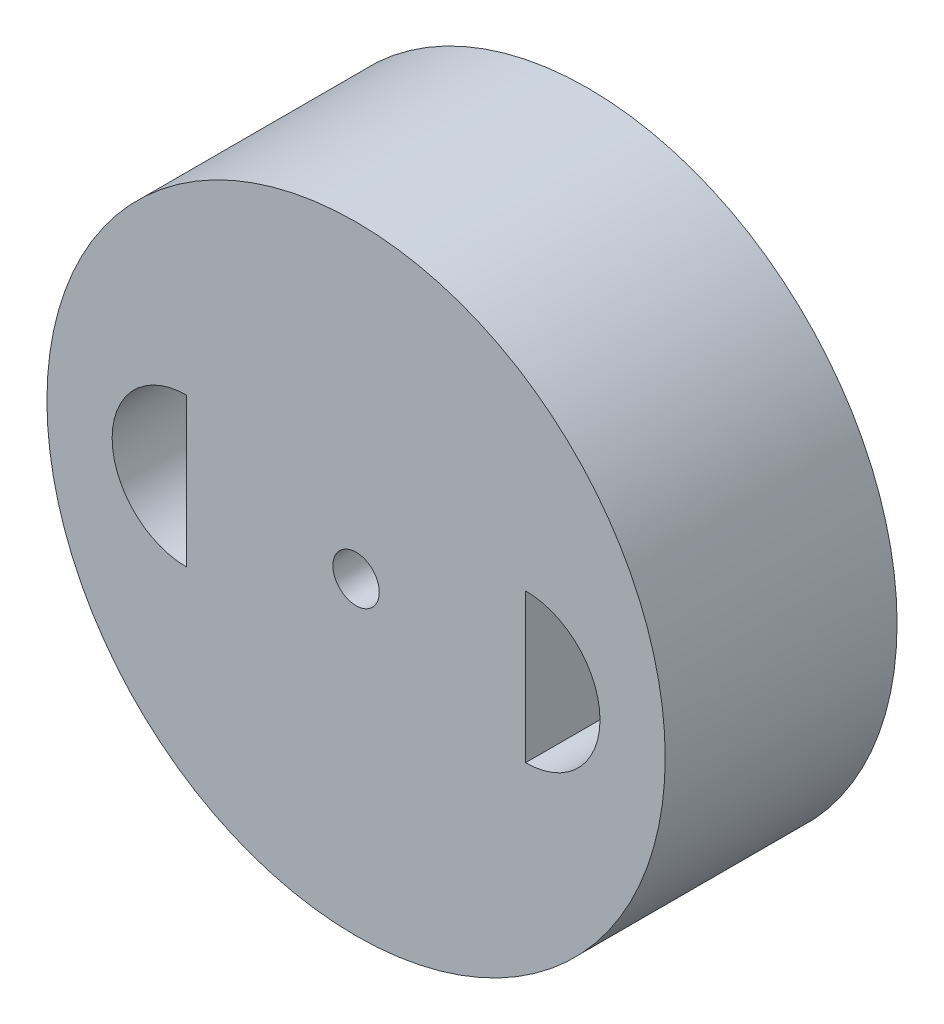
ISO-10303-21;
HEADER;
FILE_DESCRIPTION(('STEP AP214'),'2;1');
FILE_NAME('part.step','',(''),(''),'','','');
FILE_SCHEMA(('AUTOMOTIVE_DESIGN { 1 0 10303 214 1 1 1 1 }'));
ENDSEC;
DATA;
#1=APPLICATION_CONTEXT('core data for automotive mechanical design processes');
#2=APPLICATION_PROTOCOL_DEFINITION('international standard','automotive_design',2000,#1);
#3=PRODUCT_CONTEXT('',#1,'mechanical');
#4=PRODUCT('Part','Part','',(#3));
#5=PRODUCT_RELATED_PRODUCT_CATEGORY('part','',(#4));
#6=PRODUCT_DEFINITION_FORMATION('','',#4);
#7=PRODUCT_DEFINITION_CONTEXT('part definition',#1,'design');
#8=PRODUCT_DEFINITION('design','',#6,#7);
#9=PRODUCT_DEFINITION_SHAPE('','',#8);
#10=(LENGTH_UNIT() NAMED_UNIT(*) SI_UNIT(.MILLI.,.METRE.));
#11=(NAMED_UNIT(*) PLANE_ANGLE_UNIT() SI_UNIT($,.RADIAN.));
#12=(NAMED_UNIT(*) SI_UNIT($,.STERADIAN.) SOLID_ANGLE_UNIT());
#13=UNCERTAINTY_MEASURE_WITH_UNIT(LENGTH_MEASURE(1.E-05),#10,'distance_accuracy_value','');
#14=(GEOMETRIC_REPRESENTATION_CONTEXT(3) GLOBAL_UNCERTAINTY_ASSIGNED_CONTEXT((#13)) GLOBAL_UNIT_ASSIGNED_CONTEXT((#10,
#11,#12)) REPRESENTATION_CONTEXT('',''));
#15=CARTESIAN_POINT('',(0.,0.,0.));
#16=DIRECTION('',(0.,0.,1.));
#17=DIRECTION('',(1.,0.,0.));
#18=AXIS2_PLACEMENT_3D('',#15,#16,#17);
#19=CARTESIAN_POINT('',(0.,0.,76.2));
#20=DIRECTION('',(0.,0.,1.));
#21=DIRECTION('',(1.,0.,0.));
#22=AXIS2_PLACEMENT_3D('',#19,#20,#21);
#23=PLANE('',#22);
#24=CARTESIAN_POINT('',(0.,0.,76.2));
#25=DIRECTION('',(0.,0.,1.));
#26=DIRECTION('',(1.,0.,0.));
#27=AXIS2_PLACEMENT_3D('',#24,#25,#26);
#28=CIRCLE('',#27,7.62);
#29=CARTESIAN_POINT('',(7.62,0.,76.2));
#30=VERTEX_POINT('',#29);
#31=EDGE_CURVE('E96',#30,#30,#28,.T.);
#32=ORIENTED_EDGE('',*,*,#31,.F.);
#33=EDGE_LOOP('',(#32));
#34=FACE_BOUND('',#33,.T.);
#35=DIRECTION('',(0.,1.,0.));
#36=VECTOR('',#35,1.);
#37=CARTESIAN_POINT('',(55.7030268418047,0.,76.2));
#38=LINE('',#37,#36);
#39=CARTESIAN_POINT('',(55.7030268418047,24.4621758088346,76.2));
#40=VERTEX_POINT('',#39);
#41=CARTESIAN_POINT('',(55.7030268418047,-24.4621758088346,76.2));
#42=VERTEX_POINT('',#41);
#43=EDGE_CURVE('E112',#40,#42,#38,.F.);
#44=ORIENTED_EDGE('',*,*,#43,.F.);
#45=CARTESIAN_POINT('',(55.7030268418047,0.,76.2));
#46=DIRECTION('',(0.,0.,1.));
#47=DIRECTION('',(1.,0.,0.));
#48=AXIS2_PLACEMENT_3D('',#45,#46,#47);
#49=CIRCLE('',#48,24.4621758088346);
#50=EDGE_CURVE('E99',#42,#40,#49,.T.);
#51=ORIENTED_EDGE('',*,*,#50,.F.);
#52=EDGE_LOOP('',(#44,#51));
#53=FACE_BOUND('',#52,.T.);
#54=CARTESIAN_POINT('',(0.,0.,76.2));
#55=DIRECTION('',(0.,0.,1.));
#56=DIRECTION('',(1.,0.,0.));
#57=AXIS2_PLACEMENT_3D('',#54,#55,#56);
#58=CIRCLE('',#57,101.6);
#59=CARTESIAN_POINT('',(-101.6,0.,76.2));
#60=VERTEX_POINT('',#59);
#61=EDGE_CURVE('E11',#60,#60,#58,.T.);
#62=ORIENTED_EDGE('',*,*,#61,.T.);
#63=EDGE_LOOP('',(#62));
#64=FACE_BOUND('',#63,.T.);
#65=DIRECTION('',(0.,1.,0.));
#66=VECTOR('',#65,1.);
#67=CARTESIAN_POINT('',(-55.7030268418047,0.,76.2));
#68=LINE('',#67,#66);
#69=CARTESIAN_POINT('',(-55.7030268418047,24.4621758088346,76.2));
#70=VERTEX_POINT('',#69);
#71=CARTESIAN_POINT('',(-55.7030268418047,-24.4621758088346,76.2));
#72=VERTEX_POINT('',#71);
#73=EDGE_CURVE('E114',#70,#72,#68,.F.);
#74=ORIENTED_EDGE('',*,*,#73,.T.);
#75=CARTESIAN_POINT('',(-55.7030268418047,0.,76.2));
#76=DIRECTION('',(0.,0.,1.));
#77=DIRECTION('',(1.,0.,0.));
#78=AXIS2_PLACEMENT_3D('',#75,#76,#77);
#79=CIRCLE('',#78,24.4621758088346);
#80=EDGE_CURVE('E42',#72,#70,#79,.F.);
#81=ORIENTED_EDGE('',*,*,#80,.T.);
#82=EDGE_LOOP('',(#74,#81));
#83=FACE_BOUND('',#82,.T.);
#84=ADVANCED_FACE('F38',(#34,#53,#64,#83),#23,.T.);
#85=CARTESIAN_POINT('',(0.,0.,0.));
#86=DIRECTION('',(0.,0.,1.));
#87=DIRECTION('',(1.,0.,0.));
#88=AXIS2_PLACEMENT_3D('',#85,#86,#87);
#89=PLANE('',#88);
#90=CARTESIAN_POINT('',(0.,0.,0.));
#91=DIRECTION('',(0.,0.,1.));
#92=DIRECTION('',(1.,0.,0.));
#93=AXIS2_PLACEMENT_3D('',#90,#91,#92);
#94=CIRCLE('',#93,7.62);
#95=CARTESIAN_POINT('',(7.62,0.,0.));
#96=VERTEX_POINT('',#95);
#97=EDGE_CURVE('E105',#96,#96,#94,.T.);
#98=ORIENTED_EDGE('',*,*,#97,.T.);
#99=EDGE_LOOP('',(#98));
#100=FACE_BOUND('',#99,.T.);
#101=CARTESIAN_POINT('',(0.,0.,0.));
#102=DIRECTION('',(0.,0.,1.));
#103=DIRECTION('',(1.,0.,0.));
#104=AXIS2_PLACEMENT_3D('',#101,#102,#103);
#105=CIRCLE('',#104,101.6);
#106=CARTESIAN_POINT('',(-101.6,0.,0.));
#107=VERTEX_POINT('',#106);
#108=EDGE_CURVE('E48',#107,#107,#105,.T.);
#109=ORIENTED_EDGE('',*,*,#108,.F.);
#110=EDGE_LOOP('',(#109));
#111=FACE_BOUND('',#110,.T.);
#112=CARTESIAN_POINT('',(55.7030268418047,0.,0.));
#113=DIRECTION('',(0.,0.,1.));
#114=DIRECTION('',(1.,0.,0.));
#115=AXIS2_PLACEMENT_3D('',#112,#113,#114);
#116=CIRCLE('',#115,24.4621758088346);
#117=CARTESIAN_POINT('',(55.7030268418047,-24.4621758088346,0.));
#118=VERTEX_POINT('',#117);
#119=CARTESIAN_POINT('',(55.7030268418047,24.4621758088346,0.));
#120=VERTEX_POINT('',#119);
#121=EDGE_CURVE('E104',#118,#120,#116,.T.);
#122=ORIENTED_EDGE('',*,*,#121,.T.);
#123=DIRECTION('',(0.,-1.,0.));
#124=VECTOR('',#123,1.);
#125=CARTESIAN_POINT('',(55.7030268418047,0.,0.));
#126=LINE('',#125,#124);
#127=EDGE_CURVE('E101',#120,#118,#126,.T.);
#128=ORIENTED_EDGE('',*,*,#127,.T.);
#129=EDGE_LOOP('',(#122,#128));
#130=FACE_BOUND('',#129,.T.);
#131=CARTESIAN_POINT('',(-55.7030268418047,0.,0.));
#132=DIRECTION('',(0.,0.,1.));
#133=DIRECTION('',(1.,0.,0.));
#134=AXIS2_PLACEMENT_3D('',#131,#132,#133);
#135=CIRCLE('',#134,24.4621758088346);
#136=CARTESIAN_POINT('',(-55.7030268418047,-24.4621758088346,0.));
#137=VERTEX_POINT('',#136);
#138=CARTESIAN_POINT('',(-55.7030268418047,24.4621758088346,0.));
#139=VERTEX_POINT('',#138);
#140=EDGE_CURVE('E82',#137,#139,#135,.F.);
#141=ORIENTED_EDGE('',*,*,#140,.F.);
#142=DIRECTION('',(0.,-1.,0.));
#143=VECTOR('',#142,1.);
#144=CARTESIAN_POINT('',(-55.7030268418047,0.,0.));
#145=LINE('',#144,#143);
#146=EDGE_CURVE('E75',#139,#137,#145,.T.);
#147=ORIENTED_EDGE('',*,*,#146,.F.);
#148=EDGE_LOOP('',(#141,#147));
#149=FACE_BOUND('',#148,.T.);
#150=ADVANCED_FACE('F89',(#100,#111,#130,#149),#89,.F.);
#151=CARTESIAN_POINT('',(0.,0.,76.2));
#152=DIRECTION('',(0.,0.,-1.));
#153=DIRECTION('',(-1.,0.,0.));
#154=AXIS2_PLACEMENT_3D('',#151,#152,#153);
#155=CYLINDRICAL_SURFACE('',#154,101.6);
#156=CARTESIAN_POINT('',(-101.6,0.,76.2));
#157=CARTESIAN_POINT('',(-101.6,0.,75.40625));
#158=CARTESIAN_POINT('',(-101.6,0.,74.6125));
#159=CARTESIAN_POINT('',(-101.6,0.,73.025));
#160=CARTESIAN_POINT('',(-101.6,0.,72.23125));
#161=CARTESIAN_POINT('',(-101.6,0.,70.64375));
#162=CARTESIAN_POINT('',(-101.6,0.,69.85));
#163=CARTESIAN_POINT('',(-101.6,0.,68.2625));
#164=CARTESIAN_POINT('',(-101.6,0.,67.46875));
#165=CARTESIAN_POINT('',(-101.6,0.,65.88125));
#166=CARTESIAN_POINT('',(-101.6,0.,65.0875));
#167=CARTESIAN_POINT('',(-101.6,0.,63.5));
#168=CARTESIAN_POINT('',(-101.6,0.,62.70625));
#169=CARTESIAN_POINT('',(-101.6,0.,61.11875));
#170=CARTESIAN_POINT('',(-101.6,0.,60.325));
#171=CARTESIAN_POINT('',(-101.6,0.,58.7375));
#172=CARTESIAN_POINT('',(-101.6,0.,57.94375));
#173=CARTESIAN_POINT('',(-101.6,0.,56.35625));
#174=CARTESIAN_POINT('',(-101.6,0.,55.5625));
#175=CARTESIAN_POINT('',(-101.6,0.,53.975));
#176=CARTESIAN_POINT('',(-101.6,0.,53.18125));
#177=CARTESIAN_POINT('',(-101.6,0.,51.59375));
#178=CARTESIAN_POINT('',(-101.6,0.,50.8));
#179=CARTESIAN_POINT('',(-101.6,0.,49.2125));
#180=CARTESIAN_POINT('',(-101.6,0.,48.41875));
#181=CARTESIAN_POINT('',(-101.6,0.,46.83125));
#182=CARTESIAN_POINT('',(-101.6,0.,46.0375));
#183=CARTESIAN_POINT('',(-101.6,0.,44.45));
#184=CARTESIAN_POINT('',(-101.6,0.,43.65625));
#185=CARTESIAN_POINT('',(-101.6,0.,42.06875));
#186=CARTESIAN_POINT('',(-101.6,0.,41.275));
#187=CARTESIAN_POINT('',(-101.6,0.,39.6875));
#188=CARTESIAN_POINT('',(-101.6,0.,38.89375));
#189=CARTESIAN_POINT('',(-101.6,0.,37.30625));
#190=CARTESIAN_POINT('',(-101.6,0.,36.5125));
#191=CARTESIAN_POINT('',(-101.6,0.,34.925));
#192=CARTESIAN_POINT('',(-101.6,0.,34.13125));
#193=CARTESIAN_POINT('',(-101.6,0.,32.54375));
#194=CARTESIAN_POINT('',(-101.6,0.,31.75));
#195=CARTESIAN_POINT('',(-101.6,0.,30.1625));
#196=CARTESIAN_POINT('',(-101.6,0.,29.36875));
#197=CARTESIAN_POINT('',(-101.6,0.,27.78125));
#198=CARTESIAN_POINT('',(-101.6,0.,26.9875));
#199=CARTESIAN_POINT('',(-101.6,0.,25.4));
#200=CARTESIAN_POINT('',(-101.6,0.,24.60625));
#201=CARTESIAN_POINT('',(-101.6,0.,23.01875));
#202=CARTESIAN_POINT('',(-101.6,0.,22.225));
#203=CARTESIAN_POINT('',(-101.6,0.,20.6375));
#204=CARTESIAN_POINT('',(-101.6,0.,19.84375));
#205=CARTESIAN_POINT('',(-101.6,0.,18.25625));
#206=CARTESIAN_POINT('',(-101.6,0.,17.4625));
#207=CARTESIAN_POINT('',(-101.6,0.,15.875));
#208=CARTESIAN_POINT('',(-101.6,0.,15.08125));
#209=CARTESIAN_POINT('',(-101.6,0.,13.49375));
#210=CARTESIAN_POINT('',(-101.6,0.,12.7));
#211=CARTESIAN_POINT('',(-101.6,0.,11.1125));
#212=CARTESIAN_POINT('',(-101.6,0.,10.31875));
#213=CARTESIAN_POINT('',(-101.6,0.,8.73125));
#214=CARTESIAN_POINT('',(-101.6,0.,7.93750000000001));
#215=CARTESIAN_POINT('',(-101.6,0.,6.35));
#216=CARTESIAN_POINT('',(-101.6,0.,5.55625));
#217=CARTESIAN_POINT('',(-101.6,0.,3.96875));
#218=CARTESIAN_POINT('',(-101.6,0.,3.175));
#219=CARTESIAN_POINT('',(-101.6,0.,1.5875));
#220=CARTESIAN_POINT('',(-101.6,0.,0.793750000000001));
#221=CARTESIAN_POINT('',(-101.6,0.,0.));
#222=B_SPLINE_CURVE_WITH_KNOTS('',3,(#156,#157,#158,#159,#160,#161,#162,#163,#164,#165,#166,
#167,#168,#169,#170,#171,#172,#173,#174,#175,#176,#177,#178,#179,#180,#181,#182,#183,#184,#185,
#186,#187,#188,#189,#190,#191,#192,#193,#194,#195,#196,#197,#198,#199,#200,#201,#202,#203,#204,
#205,#206,#207,#208,#209,#210,#211,#212,#213,#214,#215,#216,#217,#218,#219,#220,#221),
.UNSPECIFIED.,.F.,.F.,(4,2,2,2,2,2,2,2,2,2,2,2,2,2,2,2,2,2,2,2,2,2,2,2,2,2,2,2,2,2,2,2,4),(0.,
2.38125,4.7625,7.14375,9.52500000000001,11.90625,14.2875,16.66875,19.05,21.43125,23.8125,
26.19375,28.575,30.95625,33.3375,35.71875,38.1,40.48125,42.8625,45.24375,47.625,50.00625,
52.3875,54.76875,57.15,59.53125,61.9125,64.29375,66.675,69.05625,71.4375,73.81875,76.2),.UNSPECIFIED.);
#223=EDGE_CURVE('BSEAM40',#60,#107,#222,.T.);
#224=ORIENTED_EDGE('',*,*,#61,.F.);
#225=ORIENTED_EDGE('',*,*,#108,.T.);
#226=ORIENTED_EDGE('',*,*,#223,.T.);
#227=ORIENTED_EDGE('',*,*,#223,.F.);
#228=EDGE_LOOP('',(#224,#226,#225,#227));
#229=FACE_BOUND('',#228,.T.);
#230=ADVANCED_FACE('F40',(#229),#155,.T.);
#231=CARTESIAN_POINT('',(55.7030268418047,0.,0.));
#232=DIRECTION('',(-1.,0.,0.));
#233=DIRECTION('',(0.,0.,1.));
#234=AXIS2_PLACEMENT_3D('',#231,#232,#233);
#235=PLANE('',#234);
#236=ORIENTED_EDGE('',*,*,#43,.T.);
#237=DIRECTION('',(0.,0.,1.));
#238=VECTOR('',#237,1.);
#239=CARTESIAN_POINT('',(55.7030268418047,-24.4621758088346,0.));
#240=LINE('',#239,#238);
#241=EDGE_CURVE('E93',#118,#42,#240,.T.);
#242=ORIENTED_EDGE('',*,*,#241,.F.);
#243=ORIENTED_EDGE('',*,*,#127,.F.);
#244=DIRECTION('',(0.,0.,1.));
#245=VECTOR('',#244,1.);
#246=CARTESIAN_POINT('',(55.7030268418047,24.4621758088346,0.));
#247=LINE('',#246,#245);
#248=EDGE_CURVE('E90',#120,#40,#247,.T.);
#249=ORIENTED_EDGE('',*,*,#248,.T.);
#250=EDGE_LOOP('',(#236,#242,#243,#249));
#251=FACE_BOUND('',#250,.T.);
#252=ADVANCED_FACE('F126',(#251),#235,.F.);
#253=CARTESIAN_POINT('',(55.7030268418047,0.,0.));
#254=DIRECTION('',(0.,0.,1.));
#255=DIRECTION('',(1.,0.,0.));
#256=AXIS2_PLACEMENT_3D('',#253,#254,#255);
#257=CYLINDRICAL_SURFACE('',#256,24.4621758088346);
#258=ORIENTED_EDGE('',*,*,#50,.T.);
#259=ORIENTED_EDGE('',*,*,#248,.F.);
#260=ORIENTED_EDGE('',*,*,#121,.F.);
#261=ORIENTED_EDGE('',*,*,#241,.T.);
#262=EDGE_LOOP('',(#258,#259,#260,#261));
#263=FACE_BOUND('',#262,.T.);
#264=ADVANCED_FACE('F129',(#263),#257,.F.);
#265=CARTESIAN_POINT('',(-55.7030268418047,0.,0.));
#266=DIRECTION('',(0.,0.,1.));
#267=DIRECTION('',(1.,0.,0.));
#268=AXIS2_PLACEMENT_3D('',#265,#266,#267);
#269=CYLINDRICAL_SURFACE('',#268,24.4621758088346);
#270=DIRECTION('',(0.,0.,1.));
#271=VECTOR('',#270,1.);
#272=CARTESIAN_POINT('',(-55.7030268418047,-24.4621758088346,0.));
#273=LINE('',#272,#271);
#274=EDGE_CURVE('E56',#137,#72,#273,.T.);
#275=ORIENTED_EDGE('',*,*,#274,.F.);
#276=ORIENTED_EDGE('',*,*,#140,.T.);
#277=DIRECTION('',(0.,0.,1.));
#278=VECTOR('',#277,1.);
#279=CARTESIAN_POINT('',(-55.7030268418047,24.4621758088346,0.));
#280=LINE('',#279,#278);
#281=EDGE_CURVE('E78',#139,#70,#280,.T.);
#282=ORIENTED_EDGE('',*,*,#281,.T.);
#283=ORIENTED_EDGE('',*,*,#80,.F.);
#284=EDGE_LOOP('',(#275,#276,#282,#283));
#285=FACE_BOUND('',#284,.T.);
#286=ADVANCED_FACE('F85',(#285),#269,.F.);
#287=CARTESIAN_POINT('',(-55.7030268418047,0.,0.));
#288=DIRECTION('',(-1.,0.,0.));
#289=DIRECTION('',(0.,0.,1.));
#290=AXIS2_PLACEMENT_3D('',#287,#288,#289);
#291=PLANE('',#290);
#292=ORIENTED_EDGE('',*,*,#281,.F.);
#293=ORIENTED_EDGE('',*,*,#146,.T.);
#294=ORIENTED_EDGE('',*,*,#274,.T.);
#295=ORIENTED_EDGE('',*,*,#73,.F.);
#296=EDGE_LOOP('',(#292,#293,#294,#295));
#297=FACE_BOUND('',#296,.T.);
#298=ADVANCED_FACE('F76',(#297),#291,.T.);
#299=CARTESIAN_POINT('',(0.,0.,0.));
#300=DIRECTION('',(0.,0.,1.));
#301=DIRECTION('',(1.,0.,0.));
#302=AXIS2_PLACEMENT_3D('',#299,#300,#301);
#303=CYLINDRICAL_SURFACE('',#302,7.62);
#304=CARTESIAN_POINT('',(7.62,0.,0.));
#305=CARTESIAN_POINT('',(7.62,0.,0.79375));
#306=CARTESIAN_POINT('',(7.62,0.,1.5875));
#307=CARTESIAN_POINT('',(7.62,0.,3.175));
#308=CARTESIAN_POINT('',(7.62,0.,3.96875));
#309=CARTESIAN_POINT('',(7.62,0.,5.55625));
#310=CARTESIAN_POINT('',(7.62,0.,6.35));
#311=CARTESIAN_POINT('',(7.62,0.,7.9375));
#312=CARTESIAN_POINT('',(7.62,0.,8.73125));
#313=CARTESIAN_POINT('',(7.62,0.,10.31875));
#314=CARTESIAN_POINT('',(7.62,0.,11.1125));
#315=CARTESIAN_POINT('',(7.62,0.,12.7));
#316=CARTESIAN_POINT('',(7.62,0.,13.49375));
#317=CARTESIAN_POINT('',(7.62,0.,15.08125));
#318=CARTESIAN_POINT('',(7.62,0.,15.875));
#319=CARTESIAN_POINT('',(7.62,0.,17.4625));
#320=CARTESIAN_POINT('',(7.62,0.,18.25625));
#321=CARTESIAN_POINT('',(7.62,0.,19.84375));
#322=CARTESIAN_POINT('',(7.62,0.,20.6375));
#323=CARTESIAN_POINT('',(7.62,0.,22.225));
#324=CARTESIAN_POINT('',(7.62,0.,23.01875));
#325=CARTESIAN_POINT('',(7.62,0.,24.60625));
#326=CARTESIAN_POINT('',(7.62,0.,25.4));
#327=CARTESIAN_POINT('',(7.62,0.,26.9875));
#328=CARTESIAN_POINT('',(7.62,0.,27.78125));
#329=CARTESIAN_POINT('',(7.62,0.,29.36875));
#330=CARTESIAN_POINT('',(7.62,0.,30.1625));
#331=CARTESIAN_POINT('',(7.62,0.,31.75));
#332=CARTESIAN_POINT('',(7.62,0.,32.54375));
#333=CARTESIAN_POINT('',(7.62,0.,34.13125));
#334=CARTESIAN_POINT('',(7.62,0.,34.925));
#335=CARTESIAN_POINT('',(7.62,0.,36.5125));
#336=CARTESIAN_POINT('',(7.62,0.,37.30625));
#337=CARTESIAN_POINT('',(7.62,0.,38.89375));
#338=CARTESIAN_POINT('',(7.62,0.,39.6875));
#339=CARTESIAN_POINT('',(7.62,0.,41.275));
#340=CARTESIAN_POINT('',(7.62,0.,42.06875));
#341=CARTESIAN_POINT('',(7.62,0.,43.65625));
#342=CARTESIAN_POINT('',(7.62,0.,44.45));
#343=CARTESIAN_POINT('',(7.62,0.,46.0375));
#344=CARTESIAN_POINT('',(7.62,0.,46.83125));
#345=CARTESIAN_POINT('',(7.62,0.,48.41875));
#346=CARTESIAN_POINT('',(7.62,0.,49.2125));
#347=CARTESIAN_POINT('',(7.62,0.,50.8));
#348=CARTESIAN_POINT('',(7.62,0.,51.59375));
#349=CARTESIAN_POINT('',(7.62,0.,53.18125));
#350=CARTESIAN_POINT('',(7.62,0.,53.975));
#351=CARTESIAN_POINT('',(7.62,0.,55.5625));
#352=CARTESIAN_POINT('',(7.62,0.,56.35625));
#353=CARTESIAN_POINT('',(7.62,0.,57.94375));
#354=CARTESIAN_POINT('',(7.62,0.,58.7375));
#355=CARTESIAN_POINT('',(7.62,0.,60.325));
#356=CARTESIAN_POINT('',(7.62,0.,61.11875));
#357=CARTESIAN_POINT('',(7.62,0.,62.70625));
#358=CARTESIAN_POINT('',(7.62,0.,63.5));
#359=CARTESIAN_POINT('',(7.62,0.,65.0875));
#360=CARTESIAN_POINT('',(7.62,0.,65.88125));
#361=CARTESIAN_POINT('',(7.62,0.,67.46875));
#362=CARTESIAN_POINT('',(7.62,0.,68.2625));
#363=CARTESIAN_POINT('',(7.62,0.,69.85));
#364=CARTESIAN_POINT('',(7.62,0.,70.64375));
#365=CARTESIAN_POINT('',(7.62,0.,72.23125));
#366=CARTESIAN_POINT('',(7.62,0.,73.025));
#367=CARTESIAN_POINT('',(7.62,0.,74.6125));
#368=CARTESIAN_POINT('',(7.62,0.,75.40625));
#369=CARTESIAN_POINT('',(7.62,0.,76.2));
#370=B_SPLINE_CURVE_WITH_KNOTS('',3,(#304,#305,#306,#307,#308,#309,#310,#311,#312,#313,#314,
#315,#316,#317,#318,#319,#320,#321,#322,#323,#324,#325,#326,#327,#328,#329,#330,#331,#332,#333,
#334,#335,#336,#337,#338,#339,#340,#341,#342,#343,#344,#345,#346,#347,#348,#349,#350,#351,#352,
#353,#354,#355,#356,#357,#358,#359,#360,#361,#362,#363,#364,#365,#366,#367,#368,#369),
.UNSPECIFIED.,.F.,.F.,(4,2,2,2,2,2,2,2,2,2,2,2,2,2,2,2,2,2,2,2,2,2,2,2,2,2,2,2,2,2,2,2,4),(0.,
2.38125,4.7625,7.14375,9.525,11.90625,14.2875,16.66875,19.05,21.43125,23.8125,26.19375,28.575,
30.95625,33.3375,35.71875,38.1,40.48125,42.8625,45.24375,47.625,50.00625,52.3875,54.76875,57.15,
59.53125,61.9125,64.29375,66.675,69.05625,71.4375,73.81875,76.2),.UNSPECIFIED.);
#371=EDGE_CURVE('BSEAM138',#96,#30,#370,.T.);
#372=ORIENTED_EDGE('',*,*,#97,.F.);
#373=ORIENTED_EDGE('',*,*,#31,.T.);
#374=ORIENTED_EDGE('',*,*,#371,.T.);
#375=ORIENTED_EDGE('',*,*,#371,.F.);
#376=EDGE_LOOP('',(#372,#374,#373,#375));
#377=FACE_BOUND('',#376,.T.);
#378=ADVANCED_FACE('F138',(#377),#303,.F.);
#379=CLOSED_SHELL('',(#84,#150,#230,#252,#264,#286,#298,#378));
#380=MANIFOLD_SOLID_BREP('B2',#379);
#381=ADVANCED_BREP_SHAPE_REPRESENTATION('',(#18,#380),#14);
#382=SHAPE_DEFINITION_REPRESENTATION(#9,#381);
ENDSEC;
END-ISO-10303-21;
